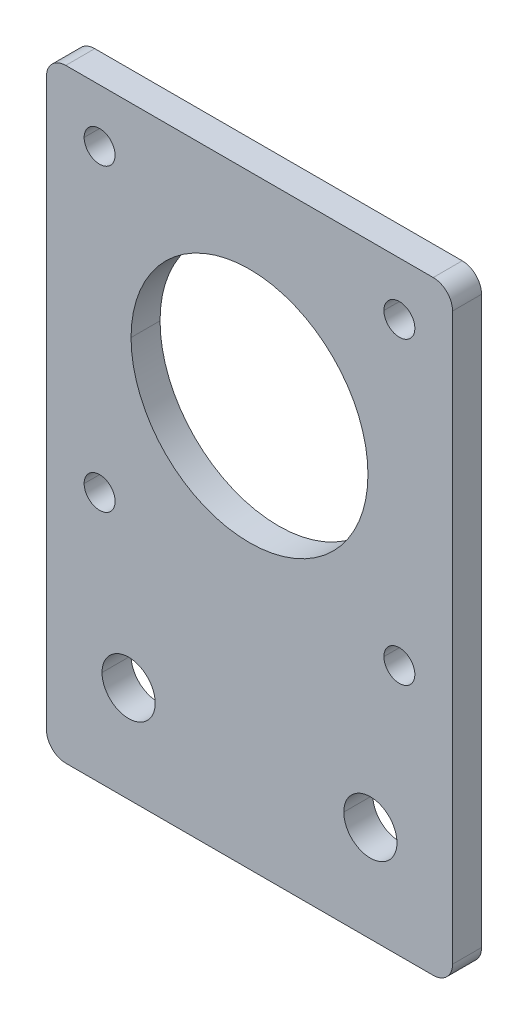
ISO-10303-21;
HEADER;
FILE_DESCRIPTION(('STEP AP214'),'2;1');
FILE_NAME('part.step','',(''),(''),'','','');
FILE_SCHEMA(('AUTOMOTIVE_DESIGN { 1 0 10303 214 1 1 1 1 }'));
ENDSEC;
DATA;
#1=APPLICATION_CONTEXT('core data for automotive mechanical design processes');
#2=APPLICATION_PROTOCOL_DEFINITION('international standard','automotive_design',2000,#1);
#3=PRODUCT_CONTEXT('',#1,'mechanical');
#4=PRODUCT('Part','Part','',(#3));
#5=PRODUCT_RELATED_PRODUCT_CATEGORY('part','',(#4));
#6=PRODUCT_DEFINITION_FORMATION('','',#4);
#7=PRODUCT_DEFINITION_CONTEXT('part definition',#1,'design');
#8=PRODUCT_DEFINITION('design','',#6,#7);
#9=PRODUCT_DEFINITION_SHAPE('','',#8);
#10=(LENGTH_UNIT() NAMED_UNIT(*) SI_UNIT(.MILLI.,.METRE.));
#11=(NAMED_UNIT(*) PLANE_ANGLE_UNIT() SI_UNIT($,.RADIAN.));
#12=(NAMED_UNIT(*) SI_UNIT($,.STERADIAN.) SOLID_ANGLE_UNIT());
#13=UNCERTAINTY_MEASURE_WITH_UNIT(LENGTH_MEASURE(1.E-05),#10,'distance_accuracy_value','');
#14=(GEOMETRIC_REPRESENTATION_CONTEXT(3) GLOBAL_UNCERTAINTY_ASSIGNED_CONTEXT((#13)) GLOBAL_UNIT_ASSIGNED_CONTEXT((#10,
#11,#12)) REPRESENTATION_CONTEXT('',''));
#15=CARTESIAN_POINT('',(0.,0.,0.));
#16=DIRECTION('',(0.,0.,1.));
#17=DIRECTION('',(1.,0.,0.));
#18=AXIS2_PLACEMENT_3D('',#15,#16,#17);
#19=CARTESIAN_POINT('',(19.,19.,1.5));
#20=DIRECTION('',(0.,0.,-1.));
#21=DIRECTION('',(-1.,0.,0.));
#22=AXIS2_PLACEMENT_3D('',#19,#20,#21);
#23=CYLINDRICAL_SURFACE('',#22,2.);
#24=CARTESIAN_POINT('',(19.,19.,1.5));
#25=DIRECTION('',(0.,0.,1.));
#26=DIRECTION('',(1.,0.,0.));
#27=AXIS2_PLACEMENT_3D('',#24,#25,#26);
#28=CIRCLE('',#27,2.);
#29=CARTESIAN_POINT('',(21.,19.,1.5));
#30=VERTEX_POINT('',#29);
#31=CARTESIAN_POINT('',(19.,21.,1.5));
#32=VERTEX_POINT('',#31);
#33=EDGE_CURVE('E258',#30,#32,#28,.T.);
#34=ORIENTED_EDGE('',*,*,#33,.F.);
#35=DIRECTION('',(0.,0.,1.));
#36=VECTOR('',#35,1.);
#37=CARTESIAN_POINT('',(21.,19.,1.5));
#38=LINE('',#37,#36);
#39=CARTESIAN_POINT('',(21.,19.,-1.5));
#40=VERTEX_POINT('',#39);
#41=EDGE_CURVE('E243',#40,#30,#38,.T.);
#42=ORIENTED_EDGE('',*,*,#41,.F.);
#43=CARTESIAN_POINT('',(19.,19.,-1.5));
#44=DIRECTION('',(0.,0.,-1.));
#45=DIRECTION('',(1.,0.,0.));
#46=AXIS2_PLACEMENT_3D('',#43,#44,#45);
#47=CIRCLE('',#46,2.);
#48=CARTESIAN_POINT('',(19.,21.,-1.5));
#49=VERTEX_POINT('',#48);
#50=EDGE_CURVE('E334',#49,#40,#47,.T.);
#51=ORIENTED_EDGE('',*,*,#50,.F.);
#52=DIRECTION('',(0.,0.,-1.));
#53=VECTOR('',#52,1.);
#54=CARTESIAN_POINT('',(19.,21.,1.5));
#55=LINE('',#54,#53);
#56=EDGE_CURVE('E11',#32,#49,#55,.T.);
#57=ORIENTED_EDGE('',*,*,#56,.F.);
#58=EDGE_LOOP('',(#34,#42,#51,#57));
#59=FACE_BOUND('',#58,.T.);
#60=ADVANCED_FACE('F17',(#59),#23,.T.);
#61=CARTESIAN_POINT('',(-19.,19.,1.5));
#62=DIRECTION('',(0.,0.,-1.));
#63=DIRECTION('',(-1.,0.,0.));
#64=AXIS2_PLACEMENT_3D('',#61,#62,#63);
#65=CYLINDRICAL_SURFACE('',#64,2.);
#66=CARTESIAN_POINT('',(-19.,19.,1.5));
#67=DIRECTION('',(0.,0.,1.));
#68=DIRECTION('',(1.,0.,0.));
#69=AXIS2_PLACEMENT_3D('',#66,#67,#68);
#70=CIRCLE('',#69,2.);
#71=CARTESIAN_POINT('',(-19.,21.,1.5));
#72=VERTEX_POINT('',#71);
#73=CARTESIAN_POINT('',(-21.,19.,1.5));
#74=VERTEX_POINT('',#73);
#75=EDGE_CURVE('E246',#72,#74,#70,.T.);
#76=ORIENTED_EDGE('',*,*,#75,.F.);
#77=DIRECTION('',(0.,0.,1.));
#78=VECTOR('',#77,1.);
#79=CARTESIAN_POINT('',(-19.,21.,1.5));
#80=LINE('',#79,#78);
#81=CARTESIAN_POINT('',(-19.,21.,-1.5));
#82=VERTEX_POINT('',#81);
#83=EDGE_CURVE('E28',#82,#72,#80,.T.);
#84=ORIENTED_EDGE('',*,*,#83,.F.);
#85=CARTESIAN_POINT('',(-19.,19.,-1.5));
#86=DIRECTION('',(0.,0.,-1.));
#87=DIRECTION('',(1.,0.,0.));
#88=AXIS2_PLACEMENT_3D('',#85,#86,#87);
#89=CIRCLE('',#88,2.);
#90=CARTESIAN_POINT('',(-21.,19.,-1.5));
#91=VERTEX_POINT('',#90);
#92=EDGE_CURVE('E275',#91,#82,#89,.T.);
#93=ORIENTED_EDGE('',*,*,#92,.F.);
#94=DIRECTION('',(0.,0.,-1.));
#95=VECTOR('',#94,1.);
#96=CARTESIAN_POINT('',(-21.,19.,1.5));
#97=LINE('',#96,#95);
#98=EDGE_CURVE('E248',#74,#91,#97,.T.);
#99=ORIENTED_EDGE('',*,*,#98,.F.);
#100=EDGE_LOOP('',(#76,#84,#93,#99));
#101=FACE_BOUND('',#100,.T.);
#102=ADVANCED_FACE('F247',(#101),#65,.T.);
#103=CARTESIAN_POINT('',(19.,-39.5,1.5));
#104=DIRECTION('',(0.,0.,-1.));
#105=DIRECTION('',(-1.,0.,0.));
#106=AXIS2_PLACEMENT_3D('',#103,#104,#105);
#107=CYLINDRICAL_SURFACE('',#106,2.);
#108=CARTESIAN_POINT('',(19.,-39.5,1.5));
#109=DIRECTION('',(0.,0.,1.));
#110=DIRECTION('',(1.,0.,0.));
#111=AXIS2_PLACEMENT_3D('',#108,#109,#110);
#112=CIRCLE('',#111,2.);
#113=CARTESIAN_POINT('',(19.,-41.5,1.5));
#114=VERTEX_POINT('',#113);
#115=CARTESIAN_POINT('',(21.,-39.5,1.5));
#116=VERTEX_POINT('',#115);
#117=EDGE_CURVE('E354',#114,#116,#112,.T.);
#118=ORIENTED_EDGE('',*,*,#117,.F.);
#119=DIRECTION('',(0.,0.,1.));
#120=VECTOR('',#119,1.);
#121=CARTESIAN_POINT('',(19.,-41.5,1.5));
#122=LINE('',#121,#120);
#123=CARTESIAN_POINT('',(19.,-41.5,-1.5));
#124=VERTEX_POINT('',#123);
#125=EDGE_CURVE('E21',#124,#114,#122,.T.);
#126=ORIENTED_EDGE('',*,*,#125,.F.);
#127=CARTESIAN_POINT('',(19.,-39.5,-1.5));
#128=DIRECTION('',(0.,0.,-1.));
#129=DIRECTION('',(1.,0.,0.));
#130=AXIS2_PLACEMENT_3D('',#127,#128,#129);
#131=CIRCLE('',#130,2.);
#132=CARTESIAN_POINT('',(21.,-39.5,-1.5));
#133=VERTEX_POINT('',#132);
#134=EDGE_CURVE('E301',#133,#124,#131,.T.);
#135=ORIENTED_EDGE('',*,*,#134,.F.);
#136=DIRECTION('',(0.,0.,-1.));
#137=VECTOR('',#136,1.);
#138=CARTESIAN_POINT('',(21.,-39.5,1.5));
#139=LINE('',#138,#137);
#140=EDGE_CURVE('E43',#116,#133,#139,.T.);
#141=ORIENTED_EDGE('',*,*,#140,.F.);
#142=EDGE_LOOP('',(#118,#126,#135,#141));
#143=FACE_BOUND('',#142,.T.);
#144=ADVANCED_FACE('F542',(#143),#107,.T.);
#145=CARTESIAN_POINT('',(-19.,-39.5,1.5));
#146=DIRECTION('',(0.,0.,-1.));
#147=DIRECTION('',(-1.,0.,0.));
#148=AXIS2_PLACEMENT_3D('',#145,#146,#147);
#149=CYLINDRICAL_SURFACE('',#148,2.);
#150=CARTESIAN_POINT('',(-19.,-39.5,1.5));
#151=DIRECTION('',(0.,0.,1.));
#152=DIRECTION('',(1.,0.,0.));
#153=AXIS2_PLACEMENT_3D('',#150,#151,#152);
#154=CIRCLE('',#153,2.);
#155=CARTESIAN_POINT('',(-21.,-39.5,1.5));
#156=VERTEX_POINT('',#155);
#157=CARTESIAN_POINT('',(-19.,-41.5,1.5));
#158=VERTEX_POINT('',#157);
#159=EDGE_CURVE('E345',#156,#158,#154,.T.);
#160=ORIENTED_EDGE('',*,*,#159,.F.);
#161=DIRECTION('',(0.,0.,1.));
#162=VECTOR('',#161,1.);
#163=CARTESIAN_POINT('',(-21.,-39.5,1.5));
#164=LINE('',#163,#162);
#165=CARTESIAN_POINT('',(-21.,-39.5,-1.5));
#166=VERTEX_POINT('',#165);
#167=EDGE_CURVE('E387',#166,#156,#164,.T.);
#168=ORIENTED_EDGE('',*,*,#167,.F.);
#169=CARTESIAN_POINT('',(-19.,-39.5,-1.5));
#170=DIRECTION('',(0.,0.,-1.));
#171=DIRECTION('',(1.,0.,0.));
#172=AXIS2_PLACEMENT_3D('',#169,#170,#171);
#173=CIRCLE('',#172,2.);
#174=CARTESIAN_POINT('',(-19.,-41.5,-1.5));
#175=VERTEX_POINT('',#174);
#176=EDGE_CURVE('E321',#175,#166,#173,.T.);
#177=ORIENTED_EDGE('',*,*,#176,.F.);
#178=DIRECTION('',(0.,0.,-1.));
#179=VECTOR('',#178,1.);
#180=CARTESIAN_POINT('',(-19.,-41.5,1.5));
#181=LINE('',#180,#179);
#182=EDGE_CURVE('E279',#158,#175,#181,.T.);
#183=ORIENTED_EDGE('',*,*,#182,.F.);
#184=EDGE_LOOP('',(#160,#168,#177,#183));
#185=FACE_BOUND('',#184,.T.);
#186=ADVANCED_FACE('F520',(#185),#149,.T.);
#187=CARTESIAN_POINT('',(12.5,-31.5,1.5));
#188=DIRECTION('',(0.,0.,-1.));
#189=DIRECTION('',(-1.,0.,0.));
#190=AXIS2_PLACEMENT_3D('',#187,#188,#189);
#191=CYLINDRICAL_SURFACE('',#190,2.75);
#192=DIRECTION('',(0.,0.,-1.));
#193=VECTOR('',#192,1.);
#194=CARTESIAN_POINT('',(15.25,-31.5,1.5));
#195=LINE('',#194,#193);
#196=CARTESIAN_POINT('',(15.25,-31.5,1.5));
#197=VERTEX_POINT('',#196);
#198=CARTESIAN_POINT('',(15.25,-31.5,-1.5));
#199=VERTEX_POINT('',#198);
#200=EDGE_CURVE('E302',#197,#199,#195,.T.);
#201=ORIENTED_EDGE('',*,*,#200,.F.);
#202=CARTESIAN_POINT('',(12.5,-31.5,1.5));
#203=DIRECTION('',(0.,0.,1.));
#204=DIRECTION('',(1.,0.,0.));
#205=AXIS2_PLACEMENT_3D('',#202,#203,#204);
#206=CIRCLE('',#205,2.75);
#207=CARTESIAN_POINT('',(9.75,-31.5,1.5));
#208=VERTEX_POINT('',#207);
#209=EDGE_CURVE('E409',#197,#208,#206,.T.);
#210=ORIENTED_EDGE('',*,*,#209,.T.);
#211=DIRECTION('',(0.,0.,-1.));
#212=VECTOR('',#211,1.);
#213=CARTESIAN_POINT('',(9.75,-31.5,1.5));
#214=LINE('',#213,#212);
#215=CARTESIAN_POINT('',(9.75,-31.5,-1.5));
#216=VERTEX_POINT('',#215);
#217=EDGE_CURVE('E270',#208,#216,#214,.T.);
#218=ORIENTED_EDGE('',*,*,#217,.T.);
#219=CARTESIAN_POINT('',(12.5,-31.5,-1.5));
#220=DIRECTION('',(0.,0.,1.));
#221=DIRECTION('',(1.,0.,0.));
#222=AXIS2_PLACEMENT_3D('',#219,#220,#221);
#223=CIRCLE('',#222,2.75);
#224=EDGE_CURVE('E384',#199,#216,#223,.T.);
#225=ORIENTED_EDGE('',*,*,#224,.F.);
#226=EDGE_LOOP('',(#201,#210,#218,#225));
#227=FACE_BOUND('',#226,.T.);
#228=ADVANCED_FACE('F486',(#227),#191,.F.);
#229=CARTESIAN_POINT('',(-12.5,-31.5,1.5));
#230=DIRECTION('',(0.,0.,-1.));
#231=DIRECTION('',(-1.,0.,0.));
#232=AXIS2_PLACEMENT_3D('',#229,#230,#231);
#233=CYLINDRICAL_SURFACE('',#232,2.75);
#234=DIRECTION('',(0.,0.,-1.));
#235=VECTOR('',#234,1.);
#236=CARTESIAN_POINT('',(-9.75,-31.5,1.5));
#237=LINE('',#236,#235);
#238=CARTESIAN_POINT('',(-9.75,-31.5,1.5));
#239=VERTEX_POINT('',#238);
#240=CARTESIAN_POINT('',(-9.75,-31.5,-1.5));
#241=VERTEX_POINT('',#240);
#242=EDGE_CURVE('E379',#239,#241,#237,.T.);
#243=ORIENTED_EDGE('',*,*,#242,.F.);
#244=CARTESIAN_POINT('',(-12.5,-31.5,1.5));
#245=DIRECTION('',(0.,0.,1.));
#246=DIRECTION('',(1.,0.,0.));
#247=AXIS2_PLACEMENT_3D('',#244,#245,#246);
#248=CIRCLE('',#247,2.75);
#249=CARTESIAN_POINT('',(-15.25,-31.5,1.5));
#250=VERTEX_POINT('',#249);
#251=EDGE_CURVE('E253',#239,#250,#248,.T.);
#252=ORIENTED_EDGE('',*,*,#251,.T.);
#253=DIRECTION('',(0.,0.,-1.));
#254=VECTOR('',#253,1.);
#255=CARTESIAN_POINT('',(-15.25,-31.5,1.5));
#256=LINE('',#255,#254);
#257=CARTESIAN_POINT('',(-15.25,-31.5,-1.5));
#258=VERTEX_POINT('',#257);
#259=EDGE_CURVE('E308',#250,#258,#256,.T.);
#260=ORIENTED_EDGE('',*,*,#259,.T.);
#261=CARTESIAN_POINT('',(-12.5,-31.5,-1.5));
#262=DIRECTION('',(0.,0.,1.));
#263=DIRECTION('',(1.,0.,0.));
#264=AXIS2_PLACEMENT_3D('',#261,#262,#263);
#265=CIRCLE('',#264,2.75);
#266=EDGE_CURVE('E388',#241,#258,#265,.T.);
#267=ORIENTED_EDGE('',*,*,#266,.F.);
#268=EDGE_LOOP('',(#243,#252,#260,#267));
#269=FACE_BOUND('',#268,.T.);
#270=ADVANCED_FACE('F691',(#269),#233,.F.);
#271=CARTESIAN_POINT('',(15.5,15.5,1.5));
#272=DIRECTION('',(0.,0.,-1.));
#273=DIRECTION('',(-1.,0.,0.));
#274=AXIS2_PLACEMENT_3D('',#271,#272,#273);
#275=CYLINDRICAL_SURFACE('',#274,1.6);
#276=DIRECTION('',(0.,0.,-1.));
#277=VECTOR('',#276,1.);
#278=CARTESIAN_POINT('',(17.1,15.5,1.5));
#279=LINE('',#278,#277);
#280=CARTESIAN_POINT('',(17.1,15.5,1.5));
#281=VERTEX_POINT('',#280);
#282=CARTESIAN_POINT('',(17.1,15.5,-1.5));
#283=VERTEX_POINT('',#282);
#284=EDGE_CURVE('E376',#281,#283,#279,.T.);
#285=ORIENTED_EDGE('',*,*,#284,.F.);
#286=CARTESIAN_POINT('',(15.5,15.5,1.5));
#287=DIRECTION('',(0.,0.,1.));
#288=DIRECTION('',(1.,0.,0.));
#289=AXIS2_PLACEMENT_3D('',#286,#287,#288);
#290=CIRCLE('',#289,1.6);
#291=CARTESIAN_POINT('',(13.9,15.5,1.5));
#292=VERTEX_POINT('',#291);
#293=EDGE_CURVE('E396',#281,#292,#290,.T.);
#294=ORIENTED_EDGE('',*,*,#293,.T.);
#295=DIRECTION('',(0.,0.,-1.));
#296=VECTOR('',#295,1.);
#297=CARTESIAN_POINT('',(13.9,15.5,1.5));
#298=LINE('',#297,#296);
#299=CARTESIAN_POINT('',(13.9,15.5,-1.5));
#300=VERTEX_POINT('',#299);
#301=EDGE_CURVE('E288',#292,#300,#298,.T.);
#302=ORIENTED_EDGE('',*,*,#301,.T.);
#303=CARTESIAN_POINT('',(15.5,15.5,-1.5));
#304=DIRECTION('',(0.,0.,1.));
#305=DIRECTION('',(1.,0.,0.));
#306=AXIS2_PLACEMENT_3D('',#303,#304,#305);
#307=CIRCLE('',#306,1.6);
#308=EDGE_CURVE('E188',#283,#300,#307,.T.);
#309=ORIENTED_EDGE('',*,*,#308,.F.);
#310=EDGE_LOOP('',(#285,#294,#302,#309));
#311=FACE_BOUND('',#310,.T.);
#312=ADVANCED_FACE('F679',(#311),#275,.F.);
#313=CARTESIAN_POINT('',(-15.5,15.5,1.5));
#314=DIRECTION('',(0.,0.,-1.));
#315=DIRECTION('',(-1.,0.,0.));
#316=AXIS2_PLACEMENT_3D('',#313,#314,#315);
#317=CYLINDRICAL_SURFACE('',#316,1.6);
#318=DIRECTION('',(0.,0.,-1.));
#319=VECTOR('',#318,1.);
#320=CARTESIAN_POINT('',(-13.9,15.5,1.5));
#321=LINE('',#320,#319);
#322=CARTESIAN_POINT('',(-13.9,15.5,1.5));
#323=VERTEX_POINT('',#322);
#324=CARTESIAN_POINT('',(-13.9,15.5,-1.5));
#325=VERTEX_POINT('',#324);
#326=EDGE_CURVE('E297',#323,#325,#321,.T.);
#327=ORIENTED_EDGE('',*,*,#326,.F.);
#328=CARTESIAN_POINT('',(-15.5,15.5,1.5));
#329=DIRECTION('',(0.,0.,1.));
#330=DIRECTION('',(1.,0.,0.));
#331=AXIS2_PLACEMENT_3D('',#328,#329,#330);
#332=CIRCLE('',#331,1.6);
#333=CARTESIAN_POINT('',(-17.1,15.5,1.5));
#334=VERTEX_POINT('',#333);
#335=EDGE_CURVE('E403',#323,#334,#332,.T.);
#336=ORIENTED_EDGE('',*,*,#335,.T.);
#337=DIRECTION('',(0.,0.,-1.));
#338=VECTOR('',#337,1.);
#339=CARTESIAN_POINT('',(-17.1,15.5,1.5));
#340=LINE('',#339,#338);
#341=CARTESIAN_POINT('',(-17.1,15.5,-1.5));
#342=VERTEX_POINT('',#341);
#343=EDGE_CURVE('E287',#334,#342,#340,.T.);
#344=ORIENTED_EDGE('',*,*,#343,.T.);
#345=CARTESIAN_POINT('',(-15.5,15.5,-1.5));
#346=DIRECTION('',(0.,0.,1.));
#347=DIRECTION('',(1.,0.,0.));
#348=AXIS2_PLACEMENT_3D('',#345,#346,#347);
#349=CIRCLE('',#348,1.6);
#350=EDGE_CURVE('E272',#325,#342,#349,.T.);
#351=ORIENTED_EDGE('',*,*,#350,.F.);
#352=EDGE_LOOP('',(#327,#336,#344,#351));
#353=FACE_BOUND('',#352,.T.);
#354=ADVANCED_FACE('F667',(#353),#317,.F.);
#355=CARTESIAN_POINT('',(-15.5,-15.5,1.5));
#356=DIRECTION('',(0.,0.,-1.));
#357=DIRECTION('',(-1.,0.,0.));
#358=AXIS2_PLACEMENT_3D('',#355,#356,#357);
#359=CYLINDRICAL_SURFACE('',#358,1.6);
#360=DIRECTION('',(0.,0.,-1.));
#361=VECTOR('',#360,1.);
#362=CARTESIAN_POINT('',(-13.9,-15.5,1.5));
#363=LINE('',#362,#361);
#364=CARTESIAN_POINT('',(-13.9,-15.5,1.5));
#365=VERTEX_POINT('',#364);
#366=CARTESIAN_POINT('',(-13.9,-15.5,-1.5));
#367=VERTEX_POINT('',#366);
#368=EDGE_CURVE('E286',#365,#367,#363,.T.);
#369=ORIENTED_EDGE('',*,*,#368,.F.);
#370=CARTESIAN_POINT('',(-15.5,-15.5,1.5));
#371=DIRECTION('',(0.,0.,1.));
#372=DIRECTION('',(1.,0.,0.));
#373=AXIS2_PLACEMENT_3D('',#370,#371,#372);
#374=CIRCLE('',#373,1.6);
#375=CARTESIAN_POINT('',(-17.1,-15.5,1.5));
#376=VERTEX_POINT('',#375);
#377=EDGE_CURVE('E393',#365,#376,#374,.T.);
#378=ORIENTED_EDGE('',*,*,#377,.T.);
#379=DIRECTION('',(0.,0.,-1.));
#380=VECTOR('',#379,1.);
#381=CARTESIAN_POINT('',(-17.1,-15.5,1.5));
#382=LINE('',#381,#380);
#383=CARTESIAN_POINT('',(-17.1,-15.5,-1.5));
#384=VERTEX_POINT('',#383);
#385=EDGE_CURVE('E380',#376,#384,#382,.T.);
#386=ORIENTED_EDGE('',*,*,#385,.T.);
#387=CARTESIAN_POINT('',(-15.5,-15.5,-1.5));
#388=DIRECTION('',(0.,0.,1.));
#389=DIRECTION('',(1.,0.,0.));
#390=AXIS2_PLACEMENT_3D('',#387,#388,#389);
#391=CIRCLE('',#390,1.6);
#392=EDGE_CURVE('E274',#367,#384,#391,.T.);
#393=ORIENTED_EDGE('',*,*,#392,.F.);
#394=EDGE_LOOP('',(#369,#378,#386,#393));
#395=FACE_BOUND('',#394,.T.);
#396=ADVANCED_FACE('F654',(#395),#359,.F.);
#397=CARTESIAN_POINT('',(15.5,-15.5,1.5));
#398=DIRECTION('',(0.,0.,-1.));
#399=DIRECTION('',(-1.,0.,0.));
#400=AXIS2_PLACEMENT_3D('',#397,#398,#399);
#401=CYLINDRICAL_SURFACE('',#400,1.6);
#402=DIRECTION('',(0.,0.,-1.));
#403=VECTOR('',#402,1.);
#404=CARTESIAN_POINT('',(17.1,-15.5,1.5));
#405=LINE('',#404,#403);
#406=CARTESIAN_POINT('',(17.1,-15.5,1.5));
#407=VERTEX_POINT('',#406);
#408=CARTESIAN_POINT('',(17.1,-15.5,-1.5));
#409=VERTEX_POINT('',#408);
#410=EDGE_CURVE('E422',#407,#409,#405,.T.);
#411=ORIENTED_EDGE('',*,*,#410,.F.);
#412=CARTESIAN_POINT('',(15.5,-15.5,1.5));
#413=DIRECTION('',(0.,0.,1.));
#414=DIRECTION('',(1.,0.,0.));
#415=AXIS2_PLACEMENT_3D('',#412,#413,#414);
#416=CIRCLE('',#415,1.6);
#417=CARTESIAN_POINT('',(13.9,-15.5,1.5));
#418=VERTEX_POINT('',#417);
#419=EDGE_CURVE('E400',#407,#418,#416,.T.);
#420=ORIENTED_EDGE('',*,*,#419,.T.);
#421=DIRECTION('',(0.,0.,-1.));
#422=VECTOR('',#421,1.);
#423=CARTESIAN_POINT('',(13.9,-15.5,1.5));
#424=LINE('',#423,#422);
#425=CARTESIAN_POINT('',(13.9,-15.5,-1.5));
#426=VERTEX_POINT('',#425);
#427=EDGE_CURVE('E326',#418,#426,#424,.T.);
#428=ORIENTED_EDGE('',*,*,#427,.T.);
#429=CARTESIAN_POINT('',(15.5,-15.5,-1.5));
#430=DIRECTION('',(0.,0.,1.));
#431=DIRECTION('',(1.,0.,0.));
#432=AXIS2_PLACEMENT_3D('',#429,#430,#431);
#433=CIRCLE('',#432,1.6);
#434=EDGE_CURVE('E300',#409,#426,#433,.T.);
#435=ORIENTED_EDGE('',*,*,#434,.F.);
#436=EDGE_LOOP('',(#411,#420,#428,#435));
#437=FACE_BOUND('',#436,.T.);
#438=ADVANCED_FACE('F642',(#437),#401,.F.);
#439=CARTESIAN_POINT('',(0.,0.,1.5));
#440=DIRECTION('',(0.,0.,-1.));
#441=DIRECTION('',(-1.,0.,0.));
#442=AXIS2_PLACEMENT_3D('',#439,#440,#441);
#443=CYLINDRICAL_SURFACE('',#442,12.25);
#444=DIRECTION('',(0.,0.,-1.));
#445=VECTOR('',#444,1.);
#446=CARTESIAN_POINT('',(12.25,0.,1.5));
#447=LINE('',#446,#445);
#448=CARTESIAN_POINT('',(12.25,0.,1.5));
#449=VERTEX_POINT('',#448);
#450=CARTESIAN_POINT('',(12.25,0.,-1.5));
#451=VERTEX_POINT('',#450);
#452=EDGE_CURVE('E358',#449,#451,#447,.T.);
#453=ORIENTED_EDGE('',*,*,#452,.F.);
#454=CARTESIAN_POINT('',(0.,0.,1.5));
#455=DIRECTION('',(0.,0.,1.));
#456=DIRECTION('',(1.,0.,0.));
#457=AXIS2_PLACEMENT_3D('',#454,#455,#456);
#458=CIRCLE('',#457,12.25);
#459=CARTESIAN_POINT('',(-12.25,0.,1.5));
#460=VERTEX_POINT('',#459);
#461=EDGE_CURVE('E397',#449,#460,#458,.T.);
#462=ORIENTED_EDGE('',*,*,#461,.T.);
#463=DIRECTION('',(0.,0.,-1.));
#464=VECTOR('',#463,1.);
#465=CARTESIAN_POINT('',(-12.25,0.,1.5));
#466=LINE('',#465,#464);
#467=CARTESIAN_POINT('',(-12.25,0.,-1.5));
#468=VERTEX_POINT('',#467);
#469=EDGE_CURVE('E346',#460,#468,#466,.T.);
#470=ORIENTED_EDGE('',*,*,#469,.T.);
#471=CARTESIAN_POINT('',(0.,0.,-1.5));
#472=DIRECTION('',(0.,0.,1.));
#473=DIRECTION('',(1.,0.,0.));
#474=AXIS2_PLACEMENT_3D('',#471,#472,#473);
#475=CIRCLE('',#474,12.25);
#476=EDGE_CURVE('E149',#451,#468,#475,.T.);
#477=ORIENTED_EDGE('',*,*,#476,.F.);
#478=EDGE_LOOP('',(#453,#462,#470,#477));
#479=FACE_BOUND('',#478,.T.);
#480=ADVANCED_FACE('F533',(#479),#443,.F.);
#481=CARTESIAN_POINT('',(-21.,21.,1.5));
#482=DIRECTION('',(0.,-1.,0.));
#483=DIRECTION('',(0.,0.,-1.));
#484=AXIS2_PLACEMENT_3D('',#481,#482,#483);
#485=PLANE('',#484);
#486=DIRECTION('',(-1.,0.,0.));
#487=VECTOR('',#486,1.);
#488=CARTESIAN_POINT('',(-21.,21.,-1.5));
#489=LINE('',#488,#487);
#490=EDGE_CURVE('E238',#49,#82,#489,.T.);
#491=ORIENTED_EDGE('',*,*,#490,.T.);
#492=ORIENTED_EDGE('',*,*,#83,.T.);
#493=DIRECTION('',(-1.,0.,0.));
#494=VECTOR('',#493,1.);
#495=CARTESIAN_POINT('',(-21.,21.,1.5));
#496=LINE('',#495,#494);
#497=EDGE_CURVE('E235',#32,#72,#496,.T.);
#498=ORIENTED_EDGE('',*,*,#497,.F.);
#499=ORIENTED_EDGE('',*,*,#56,.T.);
#500=EDGE_LOOP('',(#491,#492,#498,#499));
#501=FACE_BOUND('',#500,.T.);
#502=ADVANCED_FACE('F233',(#501),#485,.F.);
#503=CARTESIAN_POINT('',(21.,21.,1.5));
#504=DIRECTION('',(-1.,0.,0.));
#505=DIRECTION('',(0.,1.,0.));
#506=AXIS2_PLACEMENT_3D('',#503,#504,#505);
#507=PLANE('',#506);
#508=DIRECTION('',(0.,1.,0.));
#509=VECTOR('',#508,1.);
#510=CARTESIAN_POINT('',(21.,21.,1.5));
#511=LINE('',#510,#509);
#512=EDGE_CURVE('E266',#116,#30,#511,.T.);
#513=ORIENTED_EDGE('',*,*,#512,.F.);
#514=ORIENTED_EDGE('',*,*,#140,.T.);
#515=DIRECTION('',(0.,1.,0.));
#516=VECTOR('',#515,1.);
#517=CARTESIAN_POINT('',(21.,21.,-1.5));
#518=LINE('',#517,#516);
#519=EDGE_CURVE('E338',#133,#40,#518,.T.);
#520=ORIENTED_EDGE('',*,*,#519,.T.);
#521=ORIENTED_EDGE('',*,*,#41,.T.);
#522=EDGE_LOOP('',(#513,#514,#520,#521));
#523=FACE_BOUND('',#522,.T.);
#524=ADVANCED_FACE('F524',(#523),#507,.F.);
#525=CARTESIAN_POINT('',(-21.,-41.5,1.5));
#526=DIRECTION('',(0.,1.,0.));
#527=DIRECTION('',(1.,0.,0.));
#528=AXIS2_PLACEMENT_3D('',#525,#526,#527);
#529=PLANE('',#528);
#530=DIRECTION('',(1.,0.,0.));
#531=VECTOR('',#530,1.);
#532=CARTESIAN_POINT('',(-21.,-41.5,1.5));
#533=LINE('',#532,#531);
#534=EDGE_CURVE('E350',#158,#114,#533,.T.);
#535=ORIENTED_EDGE('',*,*,#534,.F.);
#536=ORIENTED_EDGE('',*,*,#182,.T.);
#537=DIRECTION('',(1.,0.,0.));
#538=VECTOR('',#537,1.);
#539=CARTESIAN_POINT('',(-21.,-41.5,-1.5));
#540=LINE('',#539,#538);
#541=EDGE_CURVE('E325',#175,#124,#540,.T.);
#542=ORIENTED_EDGE('',*,*,#541,.T.);
#543=ORIENTED_EDGE('',*,*,#125,.T.);
#544=EDGE_LOOP('',(#535,#536,#542,#543));
#545=FACE_BOUND('',#544,.T.);
#546=ADVANCED_FACE('F509',(#545),#529,.F.);
#547=CARTESIAN_POINT('',(-21.,21.,1.5));
#548=DIRECTION('',(1.,0.,0.));
#549=DIRECTION('',(0.,-1.,0.));
#550=AXIS2_PLACEMENT_3D('',#547,#548,#549);
#551=PLANE('',#550);
#552=DIRECTION('',(0.,-1.,0.));
#553=VECTOR('',#552,1.);
#554=CARTESIAN_POINT('',(-21.,21.,-1.5));
#555=LINE('',#554,#553);
#556=EDGE_CURVE('E278',#91,#166,#555,.T.);
#557=ORIENTED_EDGE('',*,*,#556,.T.);
#558=ORIENTED_EDGE('',*,*,#167,.T.);
#559=DIRECTION('',(0.,-1.,0.));
#560=VECTOR('',#559,1.);
#561=CARTESIAN_POINT('',(-21.,21.,1.5));
#562=LINE('',#561,#560);
#563=EDGE_CURVE('E342',#74,#156,#562,.T.);
#564=ORIENTED_EDGE('',*,*,#563,.F.);
#565=ORIENTED_EDGE('',*,*,#98,.T.);
#566=EDGE_LOOP('',(#557,#558,#564,#565));
#567=FACE_BOUND('',#566,.T.);
#568=ADVANCED_FACE('F491',(#567),#551,.F.);
#569=CARTESIAN_POINT('',(0.,0.,-1.5));
#570=DIRECTION('',(0.,0.,1.));
#571=DIRECTION('',(1.,0.,0.));
#572=AXIS2_PLACEMENT_3D('',#569,#570,#571);
#573=PLANE('',#572);
#574=CARTESIAN_POINT('',(12.5,-31.5,-1.5));
#575=DIRECTION('',(0.,0.,1.));
#576=DIRECTION('',(1.,0.,0.));
#577=AXIS2_PLACEMENT_3D('',#574,#575,#576);
#578=CIRCLE('',#577,2.75);
#579=EDGE_CURVE('E306',#216,#199,#578,.T.);
#580=ORIENTED_EDGE('',*,*,#579,.T.);
#581=ORIENTED_EDGE('',*,*,#224,.T.);
#582=EDGE_LOOP('',(#580,#581));
#583=FACE_BOUND('',#582,.T.);
#584=CARTESIAN_POINT('',(-12.5,-31.5,-1.5));
#585=DIRECTION('',(0.,0.,1.));
#586=DIRECTION('',(1.,0.,0.));
#587=AXIS2_PLACEMENT_3D('',#584,#585,#586);
#588=CIRCLE('',#587,2.75);
#589=EDGE_CURVE('E313',#258,#241,#588,.T.);
#590=ORIENTED_EDGE('',*,*,#589,.T.);
#591=ORIENTED_EDGE('',*,*,#266,.T.);
#592=EDGE_LOOP('',(#590,#591));
#593=FACE_BOUND('',#592,.T.);
#594=CARTESIAN_POINT('',(15.5,15.5,-1.5));
#595=DIRECTION('',(0.,0.,1.));
#596=DIRECTION('',(1.,0.,0.));
#597=AXIS2_PLACEMENT_3D('',#594,#595,#596);
#598=CIRCLE('',#597,1.6);
#599=EDGE_CURVE('E292',#300,#283,#598,.T.);
#600=ORIENTED_EDGE('',*,*,#599,.T.);
#601=ORIENTED_EDGE('',*,*,#308,.T.);
#602=EDGE_LOOP('',(#600,#601));
#603=FACE_BOUND('',#602,.T.);
#604=CARTESIAN_POINT('',(-15.5,15.5,-1.5));
#605=DIRECTION('',(0.,0.,1.));
#606=DIRECTION('',(1.,0.,0.));
#607=AXIS2_PLACEMENT_3D('',#604,#605,#606);
#608=CIRCLE('',#607,1.6);
#609=EDGE_CURVE('E293',#342,#325,#608,.T.);
#610=ORIENTED_EDGE('',*,*,#609,.T.);
#611=ORIENTED_EDGE('',*,*,#350,.T.);
#612=EDGE_LOOP('',(#610,#611));
#613=FACE_BOUND('',#612,.T.);
#614=CARTESIAN_POINT('',(-15.5,-15.5,-1.5));
#615=DIRECTION('',(0.,0.,1.));
#616=DIRECTION('',(1.,0.,0.));
#617=AXIS2_PLACEMENT_3D('',#614,#615,#616);
#618=CIRCLE('',#617,1.6);
#619=EDGE_CURVE('E320',#384,#367,#618,.T.);
#620=ORIENTED_EDGE('',*,*,#619,.T.);
#621=ORIENTED_EDGE('',*,*,#392,.T.);
#622=EDGE_LOOP('',(#620,#621));
#623=FACE_BOUND('',#622,.T.);
#624=CARTESIAN_POINT('',(15.5,-15.5,-1.5));
#625=DIRECTION('',(0.,0.,1.));
#626=DIRECTION('',(1.,0.,0.));
#627=AXIS2_PLACEMENT_3D('',#624,#625,#626);
#628=CIRCLE('',#627,1.6);
#629=EDGE_CURVE('E331',#426,#409,#628,.T.);
#630=ORIENTED_EDGE('',*,*,#629,.T.);
#631=ORIENTED_EDGE('',*,*,#434,.T.);
#632=EDGE_LOOP('',(#630,#631));
#633=FACE_BOUND('',#632,.T.);
#634=CARTESIAN_POINT('',(0.,0.,-1.5));
#635=DIRECTION('',(0.,0.,1.));
#636=DIRECTION('',(1.,0.,0.));
#637=AXIS2_PLACEMENT_3D('',#634,#635,#636);
#638=CIRCLE('',#637,12.25);
#639=EDGE_CURVE('E349',#468,#451,#638,.T.);
#640=ORIENTED_EDGE('',*,*,#639,.T.);
#641=ORIENTED_EDGE('',*,*,#476,.T.);
#642=EDGE_LOOP('',(#640,#641));
#643=FACE_BOUND('',#642,.T.);
#644=ORIENTED_EDGE('',*,*,#541,.F.);
#645=ORIENTED_EDGE('',*,*,#176,.T.);
#646=ORIENTED_EDGE('',*,*,#556,.F.);
#647=ORIENTED_EDGE('',*,*,#92,.T.);
#648=ORIENTED_EDGE('',*,*,#490,.F.);
#649=ORIENTED_EDGE('',*,*,#50,.T.);
#650=ORIENTED_EDGE('',*,*,#519,.F.);
#651=ORIENTED_EDGE('',*,*,#134,.T.);
#652=EDGE_LOOP('',(#644,#645,#646,#647,#648,#649,#650,#651));
#653=FACE_BOUND('',#652,.T.);
#654=ADVANCED_FACE('F488',(#583,#593,#603,#613,#623,#633,#643,#653),#573,.F.);
#655=CARTESIAN_POINT('',(0.,0.,1.5));
#656=DIRECTION('',(0.,0.,1.));
#657=DIRECTION('',(1.,0.,0.));
#658=AXIS2_PLACEMENT_3D('',#655,#656,#657);
#659=PLANE('',#658);
#660=CARTESIAN_POINT('',(12.5,-31.5,1.5));
#661=DIRECTION('',(0.,0.,1.));
#662=DIRECTION('',(1.,0.,0.));
#663=AXIS2_PLACEMENT_3D('',#660,#661,#662);
#664=CIRCLE('',#663,2.75);
#665=EDGE_CURVE('E307',#208,#197,#664,.T.);
#666=ORIENTED_EDGE('',*,*,#665,.F.);
#667=ORIENTED_EDGE('',*,*,#209,.F.);
#668=EDGE_LOOP('',(#666,#667));
#669=FACE_BOUND('',#668,.T.);
#670=CARTESIAN_POINT('',(15.5,15.5,1.5));
#671=DIRECTION('',(0.,0.,1.));
#672=DIRECTION('',(1.,0.,0.));
#673=AXIS2_PLACEMENT_3D('',#670,#671,#672);
#674=CIRCLE('',#673,1.6);
#675=EDGE_CURVE('E312',#292,#281,#674,.T.);
#676=ORIENTED_EDGE('',*,*,#675,.F.);
#677=ORIENTED_EDGE('',*,*,#293,.F.);
#678=EDGE_LOOP('',(#676,#677));
#679=FACE_BOUND('',#678,.T.);
#680=CARTESIAN_POINT('',(-15.5,-15.5,1.5));
#681=DIRECTION('',(0.,0.,1.));
#682=DIRECTION('',(1.,0.,0.));
#683=AXIS2_PLACEMENT_3D('',#680,#681,#682);
#684=CIRCLE('',#683,1.6);
#685=EDGE_CURVE('E282',#376,#365,#684,.T.);
#686=ORIENTED_EDGE('',*,*,#685,.F.);
#687=ORIENTED_EDGE('',*,*,#377,.F.);
#688=EDGE_LOOP('',(#686,#687));
#689=FACE_BOUND('',#688,.T.);
#690=CARTESIAN_POINT('',(0.,0.,1.5));
#691=DIRECTION('',(0.,0.,1.));
#692=DIRECTION('',(1.,0.,0.));
#693=AXIS2_PLACEMENT_3D('',#690,#691,#692);
#694=CIRCLE('',#693,12.25);
#695=EDGE_CURVE('E330',#460,#449,#694,.T.);
#696=ORIENTED_EDGE('',*,*,#695,.F.);
#697=ORIENTED_EDGE('',*,*,#461,.F.);
#698=EDGE_LOOP('',(#696,#697));
#699=FACE_BOUND('',#698,.T.);
#700=CARTESIAN_POINT('',(15.5,-15.5,1.5));
#701=DIRECTION('',(0.,0.,1.));
#702=DIRECTION('',(1.,0.,0.));
#703=AXIS2_PLACEMENT_3D('',#700,#701,#702);
#704=CIRCLE('',#703,1.6);
#705=EDGE_CURVE('E383',#418,#407,#704,.T.);
#706=ORIENTED_EDGE('',*,*,#705,.F.);
#707=ORIENTED_EDGE('',*,*,#419,.F.);
#708=EDGE_LOOP('',(#706,#707));
#709=FACE_BOUND('',#708,.T.);
#710=CARTESIAN_POINT('',(-15.5,15.5,1.5));
#711=DIRECTION('',(0.,0.,1.));
#712=DIRECTION('',(1.,0.,0.));
#713=AXIS2_PLACEMENT_3D('',#710,#711,#712);
#714=CIRCLE('',#713,1.6);
#715=EDGE_CURVE('E291',#334,#323,#714,.T.);
#716=ORIENTED_EDGE('',*,*,#715,.F.);
#717=ORIENTED_EDGE('',*,*,#335,.F.);
#718=EDGE_LOOP('',(#716,#717));
#719=FACE_BOUND('',#718,.T.);
#720=CARTESIAN_POINT('',(-12.5,-31.5,1.5));
#721=DIRECTION('',(0.,0.,1.));
#722=DIRECTION('',(1.,0.,0.));
#723=AXIS2_PLACEMENT_3D('',#720,#721,#722);
#724=CIRCLE('',#723,2.75);
#725=EDGE_CURVE('E392',#250,#239,#724,.T.);
#726=ORIENTED_EDGE('',*,*,#725,.F.);
#727=ORIENTED_EDGE('',*,*,#251,.F.);
#728=EDGE_LOOP('',(#726,#727));
#729=FACE_BOUND('',#728,.T.);
#730=ORIENTED_EDGE('',*,*,#563,.T.);
#731=ORIENTED_EDGE('',*,*,#159,.T.);
#732=ORIENTED_EDGE('',*,*,#534,.T.);
#733=ORIENTED_EDGE('',*,*,#117,.T.);
#734=ORIENTED_EDGE('',*,*,#512,.T.);
#735=ORIENTED_EDGE('',*,*,#33,.T.);
#736=ORIENTED_EDGE('',*,*,#497,.T.);
#737=ORIENTED_EDGE('',*,*,#75,.T.);
#738=EDGE_LOOP('',(#730,#731,#732,#733,#734,#735,#736,#737));
#739=FACE_BOUND('',#738,.T.);
#740=ADVANCED_FACE('F255',(#669,#679,#689,#699,#709,#719,#729,#739),#659,.T.);
#741=CARTESIAN_POINT('',(0.,0.,1.5));
#742=DIRECTION('',(0.,0.,-1.));
#743=DIRECTION('',(-1.,0.,0.));
#744=AXIS2_PLACEMENT_3D('',#741,#742,#743);
#745=CYLINDRICAL_SURFACE('',#744,12.25);
#746=ORIENTED_EDGE('',*,*,#695,.T.);
#747=ORIENTED_EDGE('',*,*,#452,.T.);
#748=ORIENTED_EDGE('',*,*,#639,.F.);
#749=ORIENTED_EDGE('',*,*,#469,.F.);
#750=EDGE_LOOP('',(#746,#747,#748,#749));
#751=FACE_BOUND('',#750,.T.);
#752=ADVANCED_FACE('F549',(#751),#745,.F.);
#753=CARTESIAN_POINT('',(15.5,-15.5,1.5));
#754=DIRECTION('',(0.,0.,-1.));
#755=DIRECTION('',(-1.,0.,0.));
#756=AXIS2_PLACEMENT_3D('',#753,#754,#755);
#757=CYLINDRICAL_SURFACE('',#756,1.6);
#758=ORIENTED_EDGE('',*,*,#705,.T.);
#759=ORIENTED_EDGE('',*,*,#410,.T.);
#760=ORIENTED_EDGE('',*,*,#629,.F.);
#761=ORIENTED_EDGE('',*,*,#427,.F.);
#762=EDGE_LOOP('',(#758,#759,#760,#761));
#763=FACE_BOUND('',#762,.T.);
#764=ADVANCED_FACE('F546',(#763),#757,.F.);
#765=CARTESIAN_POINT('',(-15.5,-15.5,1.5));
#766=DIRECTION('',(0.,0.,-1.));
#767=DIRECTION('',(-1.,0.,0.));
#768=AXIS2_PLACEMENT_3D('',#765,#766,#767);
#769=CYLINDRICAL_SURFACE('',#768,1.6);
#770=ORIENTED_EDGE('',*,*,#685,.T.);
#771=ORIENTED_EDGE('',*,*,#368,.T.);
#772=ORIENTED_EDGE('',*,*,#619,.F.);
#773=ORIENTED_EDGE('',*,*,#385,.F.);
#774=EDGE_LOOP('',(#770,#771,#772,#773));
#775=FACE_BOUND('',#774,.T.);
#776=ADVANCED_FACE('F548',(#775),#769,.F.);
#777=CARTESIAN_POINT('',(-15.5,15.5,1.5));
#778=DIRECTION('',(0.,0.,-1.));
#779=DIRECTION('',(-1.,0.,0.));
#780=AXIS2_PLACEMENT_3D('',#777,#778,#779);
#781=CYLINDRICAL_SURFACE('',#780,1.6);
#782=ORIENTED_EDGE('',*,*,#715,.T.);
#783=ORIENTED_EDGE('',*,*,#326,.T.);
#784=ORIENTED_EDGE('',*,*,#609,.F.);
#785=ORIENTED_EDGE('',*,*,#343,.F.);
#786=EDGE_LOOP('',(#782,#783,#784,#785));
#787=FACE_BOUND('',#786,.T.);
#788=ADVANCED_FACE('F593',(#787),#781,.F.);
#789=CARTESIAN_POINT('',(15.5,15.5,1.5));
#790=DIRECTION('',(0.,0.,-1.));
#791=DIRECTION('',(-1.,0.,0.));
#792=AXIS2_PLACEMENT_3D('',#789,#790,#791);
#793=CYLINDRICAL_SURFACE('',#792,1.6);
#794=ORIENTED_EDGE('',*,*,#675,.T.);
#795=ORIENTED_EDGE('',*,*,#284,.T.);
#796=ORIENTED_EDGE('',*,*,#599,.F.);
#797=ORIENTED_EDGE('',*,*,#301,.F.);
#798=EDGE_LOOP('',(#794,#795,#796,#797));
#799=FACE_BOUND('',#798,.T.);
#800=ADVANCED_FACE('F19',(#799),#793,.F.);
#801=CARTESIAN_POINT('',(-12.5,-31.5,1.5));
#802=DIRECTION('',(0.,0.,-1.));
#803=DIRECTION('',(-1.,0.,0.));
#804=AXIS2_PLACEMENT_3D('',#801,#802,#803);
#805=CYLINDRICAL_SURFACE('',#804,2.75);
#806=ORIENTED_EDGE('',*,*,#725,.T.);
#807=ORIENTED_EDGE('',*,*,#242,.T.);
#808=ORIENTED_EDGE('',*,*,#589,.F.);
#809=ORIENTED_EDGE('',*,*,#259,.F.);
#810=EDGE_LOOP('',(#806,#807,#808,#809));
#811=FACE_BOUND('',#810,.T.);
#812=ADVANCED_FACE('F552',(#811),#805,.F.);
#813=CARTESIAN_POINT('',(12.5,-31.5,1.5));
#814=DIRECTION('',(0.,0.,-1.));
#815=DIRECTION('',(-1.,0.,0.));
#816=AXIS2_PLACEMENT_3D('',#813,#814,#815);
#817=CYLINDRICAL_SURFACE('',#816,2.75);
#818=ORIENTED_EDGE('',*,*,#665,.T.);
#819=ORIENTED_EDGE('',*,*,#200,.T.);
#820=ORIENTED_EDGE('',*,*,#579,.F.);
#821=ORIENTED_EDGE('',*,*,#217,.F.);
#822=EDGE_LOOP('',(#818,#819,#820,#821));
#823=FACE_BOUND('',#822,.T.);
#824=ADVANCED_FACE('F479',(#823),#817,.F.);
#825=CLOSED_SHELL('',(#60,#102,#144,#186,#228,#270,#312,#354,#396,#438,#480,#502,#524,#546,#568,
#654,#740,#752,#764,#776,#788,#800,#812,#824));
#826=MANIFOLD_SOLID_BREP('B1',#825);
#827=ADVANCED_BREP_SHAPE_REPRESENTATION('',(#18,#826),#14);
#828=SHAPE_DEFINITION_REPRESENTATION(#9,#827);
ENDSEC;
END-ISO-10303-21;
